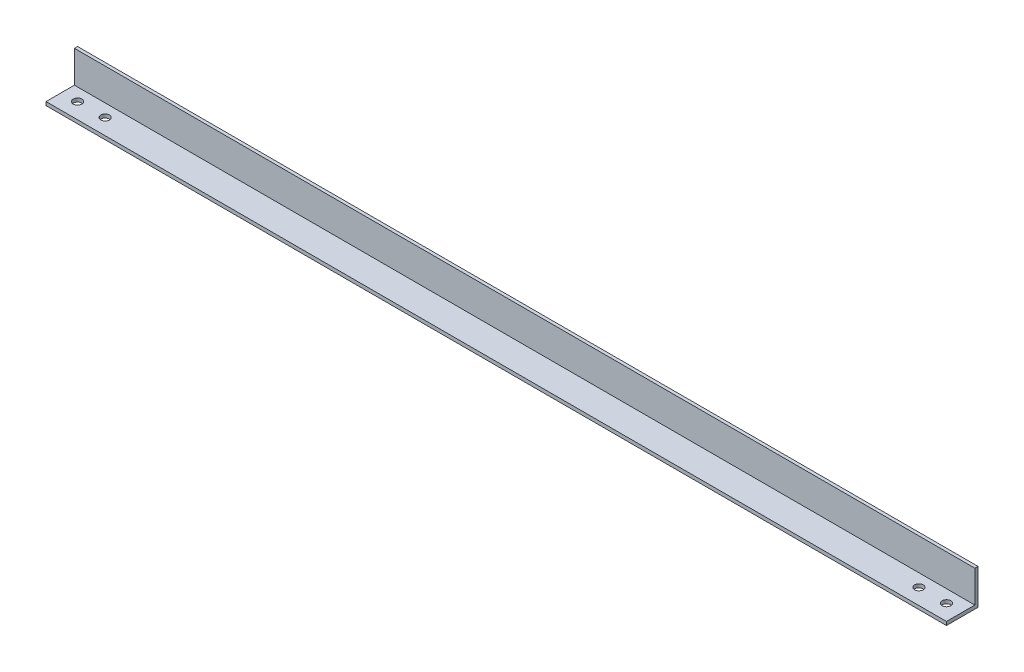
ISO-10303-21;
HEADER;
FILE_DESCRIPTION(('STEP AP214'),'2;1');
FILE_NAME('part.step','',(''),(''),'','','');
FILE_SCHEMA(('AUTOMOTIVE_DESIGN { 1 0 10303 214 1 1 1 1 }'));
ENDSEC;
DATA;
#1=APPLICATION_CONTEXT('core data for automotive mechanical design processes');
#2=APPLICATION_PROTOCOL_DEFINITION('international standard','automotive_design',2000,#1);
#3=PRODUCT_CONTEXT('',#1,'mechanical');
#4=PRODUCT('Part','Part','',(#3));
#5=PRODUCT_RELATED_PRODUCT_CATEGORY('part','',(#4));
#6=PRODUCT_DEFINITION_FORMATION('','',#4);
#7=PRODUCT_DEFINITION_CONTEXT('part definition',#1,'design');
#8=PRODUCT_DEFINITION('design','',#6,#7);
#9=PRODUCT_DEFINITION_SHAPE('','',#8);
#10=(LENGTH_UNIT() NAMED_UNIT(*) SI_UNIT(.MILLI.,.METRE.));
#11=(NAMED_UNIT(*) PLANE_ANGLE_UNIT() SI_UNIT($,.RADIAN.));
#12=(NAMED_UNIT(*) SI_UNIT($,.STERADIAN.) SOLID_ANGLE_UNIT());
#13=UNCERTAINTY_MEASURE_WITH_UNIT(LENGTH_MEASURE(1.E-05),#10,'distance_accuracy_value','');
#14=(GEOMETRIC_REPRESENTATION_CONTEXT(3) GLOBAL_UNCERTAINTY_ASSIGNED_CONTEXT((#13)) GLOBAL_UNIT_ASSIGNED_CONTEXT((#10,
#11,#12)) REPRESENTATION_CONTEXT('',''));
#15=CARTESIAN_POINT('',(0.,0.,0.));
#16=DIRECTION('',(0.,0.,1.));
#17=DIRECTION('',(1.,0.,0.));
#18=AXIS2_PLACEMENT_3D('',#15,#16,#17);
#19=CARTESIAN_POINT('',(0.,0.,8.));
#20=DIRECTION('',(0.,0.,-1.));
#21=DIRECTION('',(-1.,0.,0.));
#22=AXIS2_PLACEMENT_3D('',#19,#20,#21);
#23=PLANE('',#22);
#24=DIRECTION('',(-1.,0.,0.));
#25=VECTOR('',#24,1.);
#26=CARTESIAN_POINT('',(0.,9.,8.));
#27=LINE('',#26,#25);
#28=CARTESIAN_POINT('',(2284.,8.99999999999999,8.));
#29=VERTEX_POINT('',#28);
#30=CARTESIAN_POINT('',(0.,9.,8.));
#31=VERTEX_POINT('',#30);
#32=EDGE_CURVE('E52',#29,#31,#27,.T.);
#33=ORIENTED_EDGE('',*,*,#32,.F.);
#34=DIRECTION('',(0.,1.,0.));
#35=VECTOR('',#34,1.);
#36=CARTESIAN_POINT('',(2284.,0.,8.));
#37=LINE('',#36,#35);
#38=CARTESIAN_POINT('',(2284.,90.,8.));
#39=VERTEX_POINT('',#38);
#40=EDGE_CURVE('E112',#29,#39,#37,.T.);
#41=ORIENTED_EDGE('',*,*,#40,.T.);
#42=DIRECTION('',(-1.,0.,0.));
#43=VECTOR('',#42,1.);
#44=CARTESIAN_POINT('',(0.,90.,8.));
#45=LINE('',#44,#43);
#46=CARTESIAN_POINT('',(0.,90.,8.));
#47=VERTEX_POINT('',#46);
#48=EDGE_CURVE('E58',#39,#47,#45,.T.);
#49=ORIENTED_EDGE('',*,*,#48,.T.);
#50=DIRECTION('',(0.,-1.,0.));
#51=VECTOR('',#50,1.);
#52=CARTESIAN_POINT('',(0.,0.,8.));
#53=LINE('',#52,#51);
#54=EDGE_CURVE('E87',#47,#31,#53,.T.);
#55=ORIENTED_EDGE('',*,*,#54,.T.);
#56=EDGE_LOOP('',(#33,#41,#49,#55));
#57=FACE_BOUND('',#56,.T.);
#58=ADVANCED_FACE('F35',(#57),#23,.F.);
#59=CARTESIAN_POINT('',(0.,0.,8.));
#60=DIRECTION('',(1.,0.,0.));
#61=DIRECTION('',(0.,0.,-1.));
#62=AXIS2_PLACEMENT_3D('',#59,#60,#61);
#63=PLANE('',#62);
#64=DIRECTION('',(0.,-1.,0.));
#65=VECTOR('',#64,1.);
#66=CARTESIAN_POINT('',(0.,0.,0.));
#67=LINE('',#66,#65);
#68=CARTESIAN_POINT('',(0.,90.,0.));
#69=VERTEX_POINT('',#68);
#70=CARTESIAN_POINT('',(0.,0.,0.));
#71=VERTEX_POINT('',#70);
#72=EDGE_CURVE('E93',#69,#71,#67,.T.);
#73=ORIENTED_EDGE('',*,*,#72,.T.);
#74=DIRECTION('',(0.,0.,-1.));
#75=VECTOR('',#74,1.);
#76=CARTESIAN_POINT('',(0.,0.,8.));
#77=LINE('',#76,#75);
#78=CARTESIAN_POINT('',(0.,0.,80.));
#79=VERTEX_POINT('',#78);
#80=EDGE_CURVE('E11',#79,#71,#77,.T.);
#81=ORIENTED_EDGE('',*,*,#80,.F.);
#82=DIRECTION('',(0.,-1.,0.));
#83=VECTOR('',#82,1.);
#84=CARTESIAN_POINT('',(0.,0.,80.));
#85=LINE('',#84,#83);
#86=CARTESIAN_POINT('',(0.,9.,80.));
#87=VERTEX_POINT('',#86);
#88=EDGE_CURVE('E122',#87,#79,#85,.T.);
#89=ORIENTED_EDGE('',*,*,#88,.F.);
#90=DIRECTION('',(0.,0.,-1.));
#91=VECTOR('',#90,1.);
#92=CARTESIAN_POINT('',(0.,9.,80.));
#93=LINE('',#92,#91);
#94=EDGE_CURVE('E102',#87,#31,#93,.T.);
#95=ORIENTED_EDGE('',*,*,#94,.T.);
#96=ORIENTED_EDGE('',*,*,#54,.F.);
#97=DIRECTION('',(0.,0.,-1.));
#98=VECTOR('',#97,1.);
#99=CARTESIAN_POINT('',(0.,90.,8.));
#100=LINE('',#99,#98);
#101=EDGE_CURVE('E80',#47,#69,#100,.T.);
#102=ORIENTED_EDGE('',*,*,#101,.T.);
#103=EDGE_LOOP('',(#73,#81,#89,#95,#96,#102));
#104=FACE_BOUND('',#103,.T.);
#105=ADVANCED_FACE('F37',(#104),#63,.F.);
#106=CARTESIAN_POINT('',(0.,0.,8.));
#107=DIRECTION('',(0.,1.,0.));
#108=DIRECTION('',(0.,0.,1.));
#109=AXIS2_PLACEMENT_3D('',#106,#107,#108);
#110=PLANE('',#109);
#111=CARTESIAN_POINT('',(2244.05,0.,40.));
#112=DIRECTION('',(0.,1.,0.));
#113=DIRECTION('',(0.,0.,1.));
#114=AXIS2_PLACEMENT_3D('',#111,#112,#113);
#115=CIRCLE('',#114,11.0000000000001);
#116=CARTESIAN_POINT('',(2244.05,0.,51.0000000000002));
#117=VERTEX_POINT('',#116);
#118=EDGE_CURVE('E158',#117,#117,#115,.T.);
#119=ORIENTED_EDGE('',*,*,#118,.T.);
#120=EDGE_LOOP('',(#119));
#121=FACE_BOUND('',#120,.T.);
#122=CARTESIAN_POINT('',(2174.05,0.,40.));
#123=DIRECTION('',(0.,1.,0.));
#124=DIRECTION('',(0.,0.,1.));
#125=AXIS2_PLACEMENT_3D('',#122,#123,#124);
#126=CIRCLE('',#125,11.0000000000001);
#127=CARTESIAN_POINT('',(2174.05,0.,51.0000000000001));
#128=VERTEX_POINT('',#127);
#129=EDGE_CURVE('E152',#128,#128,#126,.T.);
#130=ORIENTED_EDGE('',*,*,#129,.T.);
#131=EDGE_LOOP('',(#130));
#132=FACE_BOUND('',#131,.T.);
#133=CARTESIAN_POINT('',(109.95,0.,40.));
#134=DIRECTION('',(0.,1.,0.));
#135=DIRECTION('',(0.,0.,1.));
#136=AXIS2_PLACEMENT_3D('',#133,#134,#135);
#137=CIRCLE('',#136,11.);
#138=CARTESIAN_POINT('',(109.95,0.,51.));
#139=VERTEX_POINT('',#138);
#140=EDGE_CURVE('E146',#139,#139,#137,.T.);
#141=ORIENTED_EDGE('',*,*,#140,.T.);
#142=EDGE_LOOP('',(#141));
#143=FACE_BOUND('',#142,.T.);
#144=CARTESIAN_POINT('',(39.95,0.,40.));
#145=DIRECTION('',(0.,1.,0.));
#146=DIRECTION('',(0.,0.,1.));
#147=AXIS2_PLACEMENT_3D('',#144,#145,#146);
#148=CIRCLE('',#147,11.);
#149=CARTESIAN_POINT('',(39.95,0.,51.));
#150=VERTEX_POINT('',#149);
#151=EDGE_CURVE('E123',#150,#150,#148,.T.);
#152=ORIENTED_EDGE('',*,*,#151,.T.);
#153=EDGE_LOOP('',(#152));
#154=FACE_BOUND('',#153,.T.);
#155=DIRECTION('',(1.,0.,0.));
#156=VECTOR('',#155,1.);
#157=CARTESIAN_POINT('',(0.,0.,0.));
#158=LINE('',#157,#156);
#159=CARTESIAN_POINT('',(2284.,0.,0.));
#160=VERTEX_POINT('',#159);
#161=EDGE_CURVE('E97',#71,#160,#158,.T.);
#162=ORIENTED_EDGE('',*,*,#161,.T.);
#163=DIRECTION('',(0.,0.,-1.));
#164=VECTOR('',#163,1.);
#165=CARTESIAN_POINT('',(2284.,0.,8.));
#166=LINE('',#165,#164);
#167=CARTESIAN_POINT('',(2284.,0.,80.));
#168=VERTEX_POINT('',#167);
#169=EDGE_CURVE('E44',#168,#160,#166,.T.);
#170=ORIENTED_EDGE('',*,*,#169,.F.);
#171=DIRECTION('',(1.,0.,0.));
#172=VECTOR('',#171,1.);
#173=CARTESIAN_POINT('',(0.,0.,80.));
#174=LINE('',#173,#172);
#175=EDGE_CURVE('E135',#79,#168,#174,.T.);
#176=ORIENTED_EDGE('',*,*,#175,.F.);
#177=ORIENTED_EDGE('',*,*,#80,.T.);
#178=EDGE_LOOP('',(#162,#170,#176,#177));
#179=FACE_BOUND('',#178,.T.);
#180=ADVANCED_FACE('F167',(#121,#132,#143,#154,#179),#110,.F.);
#181=CARTESIAN_POINT('',(2284.,0.,8.));
#182=DIRECTION('',(-1.,0.,0.));
#183=DIRECTION('',(0.,0.,1.));
#184=AXIS2_PLACEMENT_3D('',#181,#182,#183);
#185=PLANE('',#184);
#186=DIRECTION('',(0.,1.,0.));
#187=VECTOR('',#186,1.);
#188=CARTESIAN_POINT('',(2284.,0.,0.));
#189=LINE('',#188,#187);
#190=CARTESIAN_POINT('',(2284.,90.,0.));
#191=VERTEX_POINT('',#190);
#192=EDGE_CURVE('E88',#160,#191,#189,.T.);
#193=ORIENTED_EDGE('',*,*,#192,.T.);
#194=DIRECTION('',(0.,0.,-1.));
#195=VECTOR('',#194,1.);
#196=CARTESIAN_POINT('',(2284.,90.,8.));
#197=LINE('',#196,#195);
#198=EDGE_CURVE('E83',#39,#191,#197,.T.);
#199=ORIENTED_EDGE('',*,*,#198,.F.);
#200=ORIENTED_EDGE('',*,*,#40,.F.);
#201=DIRECTION('',(0.,0.,-1.));
#202=VECTOR('',#201,1.);
#203=CARTESIAN_POINT('',(2284.,9.,80.));
#204=LINE('',#203,#202);
#205=CARTESIAN_POINT('',(2284.,9.,80.));
#206=VERTEX_POINT('',#205);
#207=EDGE_CURVE('E98',#206,#29,#204,.T.);
#208=ORIENTED_EDGE('',*,*,#207,.F.);
#209=DIRECTION('',(0.,1.,0.));
#210=VECTOR('',#209,1.);
#211=CARTESIAN_POINT('',(2284.,0.,80.));
#212=LINE('',#211,#210);
#213=EDGE_CURVE('E130',#168,#206,#212,.T.);
#214=ORIENTED_EDGE('',*,*,#213,.F.);
#215=ORIENTED_EDGE('',*,*,#169,.T.);
#216=EDGE_LOOP('',(#193,#199,#200,#208,#214,#215));
#217=FACE_BOUND('',#216,.T.);
#218=ADVANCED_FACE('F198',(#217),#185,.F.);
#219=CARTESIAN_POINT('',(0.,90.,8.));
#220=DIRECTION('',(0.,-1.,0.));
#221=DIRECTION('',(1.,0.,0.));
#222=AXIS2_PLACEMENT_3D('',#219,#220,#221);
#223=PLANE('',#222);
#224=DIRECTION('',(-1.,0.,0.));
#225=VECTOR('',#224,1.);
#226=CARTESIAN_POINT('',(0.,90.,0.));
#227=LINE('',#226,#225);
#228=EDGE_CURVE('E77',#191,#69,#227,.T.);
#229=ORIENTED_EDGE('',*,*,#228,.T.);
#230=ORIENTED_EDGE('',*,*,#101,.F.);
#231=ORIENTED_EDGE('',*,*,#48,.F.);
#232=ORIENTED_EDGE('',*,*,#198,.T.);
#233=EDGE_LOOP('',(#229,#230,#231,#232));
#234=FACE_BOUND('',#233,.T.);
#235=ADVANCED_FACE('F79',(#234),#223,.F.);
#236=CARTESIAN_POINT('',(0.,0.,0.));
#237=DIRECTION('',(0.,0.,-1.));
#238=DIRECTION('',(-1.,0.,0.));
#239=AXIS2_PLACEMENT_3D('',#236,#237,#238);
#240=PLANE('',#239);
#241=ORIENTED_EDGE('',*,*,#72,.F.);
#242=ORIENTED_EDGE('',*,*,#228,.F.);
#243=ORIENTED_EDGE('',*,*,#192,.F.);
#244=ORIENTED_EDGE('',*,*,#161,.F.);
#245=EDGE_LOOP('',(#241,#242,#243,#244));
#246=FACE_BOUND('',#245,.T.);
#247=ADVANCED_FACE('F96',(#246),#240,.T.);
#248=CARTESIAN_POINT('',(0.,9.,80.));
#249=DIRECTION('',(0.,-1.,0.));
#250=DIRECTION('',(0.,0.,-1.));
#251=AXIS2_PLACEMENT_3D('',#248,#249,#250);
#252=PLANE('',#251);
#253=CARTESIAN_POINT('',(2244.05,9.,40.));
#254=DIRECTION('',(0.,1.,0.));
#255=DIRECTION('',(0.,0.,1.));
#256=AXIS2_PLACEMENT_3D('',#253,#254,#255);
#257=CIRCLE('',#256,11.0000000000001);
#258=CARTESIAN_POINT('',(2244.05,9.,51.0000000000002));
#259=VERTEX_POINT('',#258);
#260=EDGE_CURVE('E161',#259,#259,#257,.T.);
#261=ORIENTED_EDGE('',*,*,#260,.F.);
#262=EDGE_LOOP('',(#261));
#263=FACE_BOUND('',#262,.T.);
#264=CARTESIAN_POINT('',(2174.05,9.,40.));
#265=DIRECTION('',(0.,1.,0.));
#266=DIRECTION('',(0.,0.,1.));
#267=AXIS2_PLACEMENT_3D('',#264,#265,#266);
#268=CIRCLE('',#267,11.0000000000001);
#269=CARTESIAN_POINT('',(2174.05,9.,51.0000000000001));
#270=VERTEX_POINT('',#269);
#271=EDGE_CURVE('E155',#270,#270,#268,.T.);
#272=ORIENTED_EDGE('',*,*,#271,.F.);
#273=EDGE_LOOP('',(#272));
#274=FACE_BOUND('',#273,.T.);
#275=CARTESIAN_POINT('',(109.95,9.,40.));
#276=DIRECTION('',(0.,1.,0.));
#277=DIRECTION('',(0.,0.,1.));
#278=AXIS2_PLACEMENT_3D('',#275,#276,#277);
#279=CIRCLE('',#278,11.);
#280=CARTESIAN_POINT('',(109.95,9.,51.));
#281=VERTEX_POINT('',#280);
#282=EDGE_CURVE('E149',#281,#281,#279,.T.);
#283=ORIENTED_EDGE('',*,*,#282,.F.);
#284=EDGE_LOOP('',(#283));
#285=FACE_BOUND('',#284,.T.);
#286=CARTESIAN_POINT('',(39.95,9.,40.));
#287=DIRECTION('',(0.,1.,0.));
#288=DIRECTION('',(0.,0.,1.));
#289=AXIS2_PLACEMENT_3D('',#286,#287,#288);
#290=CIRCLE('',#289,11.);
#291=CARTESIAN_POINT('',(39.95,9.,51.));
#292=VERTEX_POINT('',#291);
#293=EDGE_CURVE('E143',#292,#292,#290,.T.);
#294=ORIENTED_EDGE('',*,*,#293,.F.);
#295=EDGE_LOOP('',(#294));
#296=FACE_BOUND('',#295,.T.);
#297=ORIENTED_EDGE('',*,*,#32,.T.);
#298=ORIENTED_EDGE('',*,*,#94,.F.);
#299=DIRECTION('',(-1.,0.,0.));
#300=VECTOR('',#299,1.);
#301=CARTESIAN_POINT('',(0.,9.,80.));
#302=LINE('',#301,#300);
#303=EDGE_CURVE('E119',#206,#87,#302,.T.);
#304=ORIENTED_EDGE('',*,*,#303,.F.);
#305=ORIENTED_EDGE('',*,*,#207,.T.);
#306=EDGE_LOOP('',(#297,#298,#304,#305));
#307=FACE_BOUND('',#306,.T.);
#308=ADVANCED_FACE('F177',(#263,#274,#285,#296,#307),#252,.F.);
#309=CARTESIAN_POINT('',(0.,9.,80.));
#310=DIRECTION('',(0.,0.,-1.));
#311=DIRECTION('',(-1.,0.,0.));
#312=AXIS2_PLACEMENT_3D('',#309,#310,#311);
#313=PLANE('',#312);
#314=ORIENTED_EDGE('',*,*,#88,.T.);
#315=ORIENTED_EDGE('',*,*,#175,.T.);
#316=ORIENTED_EDGE('',*,*,#213,.T.);
#317=ORIENTED_EDGE('',*,*,#303,.T.);
#318=EDGE_LOOP('',(#314,#315,#316,#317));
#319=FACE_BOUND('',#318,.T.);
#320=ADVANCED_FACE('F180',(#319),#313,.F.);
#321=CARTESIAN_POINT('',(39.95,0.,40.));
#322=DIRECTION('',(0.,1.,0.));
#323=DIRECTION('',(0.,0.,1.));
#324=AXIS2_PLACEMENT_3D('',#321,#322,#323);
#325=CYLINDRICAL_SURFACE('',#324,11.);
#326=ORIENTED_EDGE('',*,*,#151,.F.);
#327=EDGE_LOOP('',(#326));
#328=FACE_BOUND('',#327,.T.);
#329=ORIENTED_EDGE('',*,*,#293,.T.);
#330=EDGE_LOOP('',(#329));
#331=FACE_BOUND('',#330,.T.);
#332=ADVANCED_FACE('F239',(#328,#331),#325,.F.);
#333=CARTESIAN_POINT('',(109.95,0.,40.));
#334=DIRECTION('',(0.,1.,0.));
#335=DIRECTION('',(0.,0.,1.));
#336=AXIS2_PLACEMENT_3D('',#333,#334,#335);
#337=CYLINDRICAL_SURFACE('',#336,11.);
#338=ORIENTED_EDGE('',*,*,#140,.F.);
#339=EDGE_LOOP('',(#338));
#340=FACE_BOUND('',#339,.T.);
#341=ORIENTED_EDGE('',*,*,#282,.T.);
#342=EDGE_LOOP('',(#341));
#343=FACE_BOUND('',#342,.T.);
#344=ADVANCED_FACE('F244',(#340,#343),#337,.F.);
#345=CARTESIAN_POINT('',(2174.05,0.,40.));
#346=DIRECTION('',(0.,1.,0.));
#347=DIRECTION('',(0.,0.,1.));
#348=AXIS2_PLACEMENT_3D('',#345,#346,#347);
#349=CYLINDRICAL_SURFACE('',#348,11.0000000000001);
#350=ORIENTED_EDGE('',*,*,#129,.F.);
#351=EDGE_LOOP('',(#350));
#352=FACE_BOUND('',#351,.T.);
#353=ORIENTED_EDGE('',*,*,#271,.T.);
#354=EDGE_LOOP('',(#353));
#355=FACE_BOUND('',#354,.T.);
#356=ADVANCED_FACE('F173',(#352,#355),#349,.F.);
#357=CARTESIAN_POINT('',(2244.05,0.,40.));
#358=DIRECTION('',(0.,1.,0.));
#359=DIRECTION('',(0.,0.,1.));
#360=AXIS2_PLACEMENT_3D('',#357,#358,#359);
#361=CYLINDRICAL_SURFACE('',#360,11.0000000000001);
#362=ORIENTED_EDGE('',*,*,#118,.F.);
#363=EDGE_LOOP('',(#362));
#364=FACE_BOUND('',#363,.T.);
#365=ORIENTED_EDGE('',*,*,#260,.T.);
#366=EDGE_LOOP('',(#365));
#367=FACE_BOUND('',#366,.T.);
#368=ADVANCED_FACE('F170',(#364,#367),#361,.F.);
#369=CLOSED_SHELL('',(#58,#105,#180,#218,#235,#247,#308,#320,#332,#344,#356,#368));
#370=MANIFOLD_SOLID_BREP('B2',#369);
#371=ADVANCED_BREP_SHAPE_REPRESENTATION('',(#18,#370),#14);
#372=SHAPE_DEFINITION_REPRESENTATION(#9,#371);
ENDSEC;
END-ISO-10303-21;
